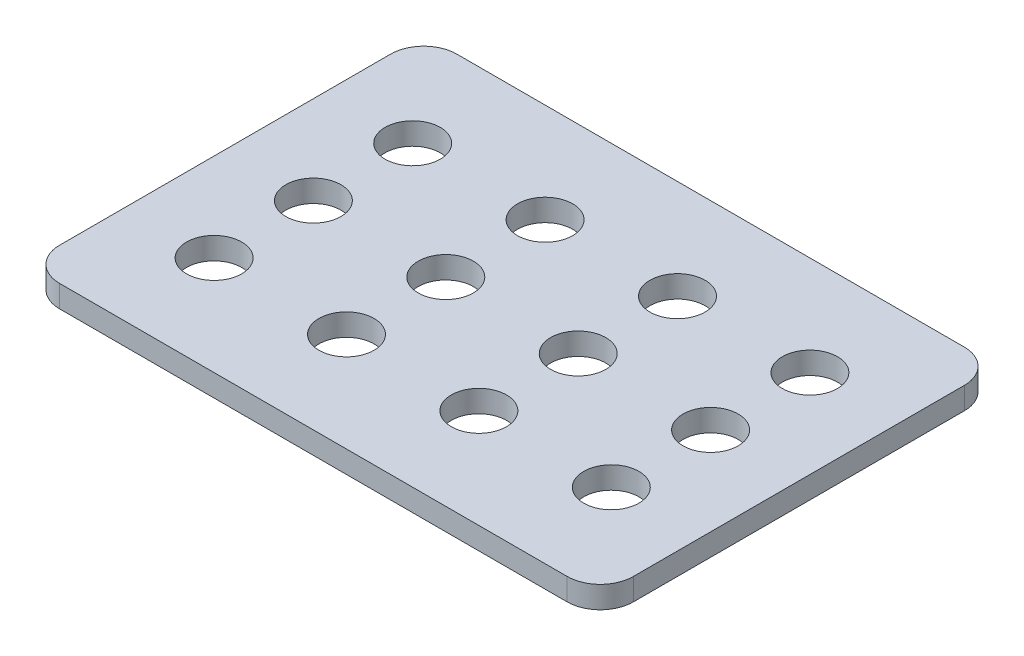
ISO-10303-21;
HEADER;
FILE_DESCRIPTION(('STEP AP214'),'2;1');
FILE_NAME('part.step','',(''),(''),'','','');
FILE_SCHEMA(('AUTOMOTIVE_DESIGN { 1 0 10303 214 1 1 1 1 }'));
ENDSEC;
DATA;
#1=APPLICATION_CONTEXT('core data for automotive mechanical design processes');
#2=APPLICATION_PROTOCOL_DEFINITION('international standard','automotive_design',2000,#1);
#3=PRODUCT_CONTEXT('',#1,'mechanical');
#4=PRODUCT('Part','Part','',(#3));
#5=PRODUCT_RELATED_PRODUCT_CATEGORY('part','',(#4));
#6=PRODUCT_DEFINITION_FORMATION('','',#4);
#7=PRODUCT_DEFINITION_CONTEXT('part definition',#1,'design');
#8=PRODUCT_DEFINITION('design','',#6,#7);
#9=PRODUCT_DEFINITION_SHAPE('','',#8);
#10=(LENGTH_UNIT() NAMED_UNIT(*) SI_UNIT(.MILLI.,.METRE.));
#11=(NAMED_UNIT(*) PLANE_ANGLE_UNIT() SI_UNIT($,.RADIAN.));
#12=(NAMED_UNIT(*) SI_UNIT($,.STERADIAN.) SOLID_ANGLE_UNIT());
#13=UNCERTAINTY_MEASURE_WITH_UNIT(LENGTH_MEASURE(1.E-05),#10,'distance_accuracy_value','');
#14=(GEOMETRIC_REPRESENTATION_CONTEXT(3) GLOBAL_UNCERTAINTY_ASSIGNED_CONTEXT((#13)) GLOBAL_UNIT_ASSIGNED_CONTEXT((#10,
#11,#12)) REPRESENTATION_CONTEXT('',''));
#15=CARTESIAN_POINT('',(0.,0.,0.));
#16=DIRECTION('',(0.,0.,1.));
#17=DIRECTION('',(1.,0.,0.));
#18=AXIS2_PLACEMENT_3D('',#15,#16,#17);
#19=CARTESIAN_POINT('',(15.,10.,-15.));
#20=DIRECTION('',(0.,-1.,0.));
#21=DIRECTION('',(0.,0.,-1.));
#22=AXIS2_PLACEMENT_3D('',#19,#20,#21);
#23=CYLINDRICAL_SURFACE('',#22,15.);
#24=CARTESIAN_POINT('',(15.,0.,-15.));
#25=DIRECTION('',(0.,1.,0.));
#26=DIRECTION('',(0.,0.,1.));
#27=AXIS2_PLACEMENT_3D('',#24,#25,#26);
#28=CIRCLE('',#27,15.);
#29=CARTESIAN_POINT('',(15.0000000000001,0.,0.));
#30=VERTEX_POINT('',#29);
#31=CARTESIAN_POINT('',(0.,0.,-15.0000000000001));
#32=VERTEX_POINT('',#31);
#33=EDGE_CURVE('E196',#30,#32,#28,.F.);
#34=ORIENTED_EDGE('',*,*,#33,.F.);
#35=DIRECTION('',(0.,-1.,0.));
#36=VECTOR('',#35,1.);
#37=CARTESIAN_POINT('',(15.0000000000001,10.,0.));
#38=LINE('',#37,#36);
#39=CARTESIAN_POINT('',(15.0000000000001,10.,0.));
#40=VERTEX_POINT('',#39);
#41=EDGE_CURVE('E11',#40,#30,#38,.T.);
#42=ORIENTED_EDGE('',*,*,#41,.F.);
#43=CARTESIAN_POINT('',(15.,10.,-15.));
#44=DIRECTION('',(0.,1.,0.));
#45=DIRECTION('',(0.,0.,1.));
#46=AXIS2_PLACEMENT_3D('',#43,#44,#45);
#47=CIRCLE('',#46,15.);
#48=CARTESIAN_POINT('',(0.,10.,-15.0000000000001));
#49=VERTEX_POINT('',#48);
#50=EDGE_CURVE('E511',#40,#49,#47,.F.);
#51=ORIENTED_EDGE('',*,*,#50,.T.);
#52=DIRECTION('',(0.,-1.,0.));
#53=VECTOR('',#52,1.);
#54=CARTESIAN_POINT('',(0.,10.,-15.0000000000001));
#55=LINE('',#54,#53);
#56=EDGE_CURVE('E62',#49,#32,#55,.T.);
#57=ORIENTED_EDGE('',*,*,#56,.T.);
#58=EDGE_LOOP('',(#34,#42,#51,#57));
#59=FACE_BOUND('',#58,.T.);
#60=ADVANCED_FACE('F50',(#59),#23,.T.);
#61=CARTESIAN_POINT('',(0.,10.,0.));
#62=DIRECTION('',(0.,0.,-1.));
#63=DIRECTION('',(-1.,0.,0.));
#64=AXIS2_PLACEMENT_3D('',#61,#62,#63);
#65=PLANE('',#64);
#66=DIRECTION('',(1.,0.,0.));
#67=VECTOR('',#66,1.);
#68=CARTESIAN_POINT('',(0.,0.,0.));
#69=LINE('',#68,#67);
#70=CARTESIAN_POINT('',(245.,0.,0.));
#71=VERTEX_POINT('',#70);
#72=EDGE_CURVE('E203',#30,#71,#69,.T.);
#73=ORIENTED_EDGE('',*,*,#72,.T.);
#74=DIRECTION('',(0.,-1.,0.));
#75=VECTOR('',#74,1.);
#76=CARTESIAN_POINT('',(245.,10.,0.));
#77=LINE('',#76,#75);
#78=CARTESIAN_POINT('',(245.,10.,0.));
#79=VERTEX_POINT('',#78);
#80=EDGE_CURVE('E60',#79,#71,#77,.T.);
#81=ORIENTED_EDGE('',*,*,#80,.F.);
#82=DIRECTION('',(1.,0.,0.));
#83=VECTOR('',#82,1.);
#84=CARTESIAN_POINT('',(0.,10.,0.));
#85=LINE('',#84,#83);
#86=EDGE_CURVE('E508',#40,#79,#85,.T.);
#87=ORIENTED_EDGE('',*,*,#86,.F.);
#88=ORIENTED_EDGE('',*,*,#41,.T.);
#89=EDGE_LOOP('',(#73,#81,#87,#88));
#90=FACE_BOUND('',#89,.T.);
#91=ADVANCED_FACE('F273',(#90),#65,.F.);
#92=CARTESIAN_POINT('',(245.,10.,-15.));
#93=DIRECTION('',(0.,-1.,0.));
#94=DIRECTION('',(0.,0.,-1.));
#95=AXIS2_PLACEMENT_3D('',#92,#93,#94);
#96=CYLINDRICAL_SURFACE('',#95,15.);
#97=CARTESIAN_POINT('',(245.,0.,-15.));
#98=DIRECTION('',(0.,1.,0.));
#99=DIRECTION('',(0.,0.,1.));
#100=AXIS2_PLACEMENT_3D('',#97,#98,#99);
#101=CIRCLE('',#100,15.);
#102=CARTESIAN_POINT('',(260.,0.,-15.0000000000001));
#103=VERTEX_POINT('',#102);
#104=EDGE_CURVE('E202',#71,#103,#101,.T.);
#105=ORIENTED_EDGE('',*,*,#104,.T.);
#106=DIRECTION('',(0.,-1.,0.));
#107=VECTOR('',#106,1.);
#108=CARTESIAN_POINT('',(260.,10.,-15.0000000000001));
#109=LINE('',#108,#107);
#110=CARTESIAN_POINT('',(260.,10.,-15.0000000000001));
#111=VERTEX_POINT('',#110);
#112=EDGE_CURVE('E257',#111,#103,#109,.T.);
#113=ORIENTED_EDGE('',*,*,#112,.F.);
#114=CARTESIAN_POINT('',(245.,10.,-15.));
#115=DIRECTION('',(0.,1.,0.));
#116=DIRECTION('',(0.,0.,1.));
#117=AXIS2_PLACEMENT_3D('',#114,#115,#116);
#118=CIRCLE('',#117,15.);
#119=EDGE_CURVE('E269',#79,#111,#118,.T.);
#120=ORIENTED_EDGE('',*,*,#119,.F.);
#121=ORIENTED_EDGE('',*,*,#80,.T.);
#122=EDGE_LOOP('',(#105,#113,#120,#121));
#123=FACE_BOUND('',#122,.T.);
#124=ADVANCED_FACE('F270',(#123),#96,.T.);
#125=CARTESIAN_POINT('',(260.,10.,0.));
#126=DIRECTION('',(-1.,0.,0.));
#127=DIRECTION('',(0.,0.,1.));
#128=AXIS2_PLACEMENT_3D('',#125,#126,#127);
#129=PLANE('',#128);
#130=DIRECTION('',(0.,0.,-1.));
#131=VECTOR('',#130,1.);
#132=CARTESIAN_POINT('',(260.,0.,0.));
#133=LINE('',#132,#131);
#134=CARTESIAN_POINT('',(260.,0.,-165.));
#135=VERTEX_POINT('',#134);
#136=EDGE_CURVE('E207',#103,#135,#133,.T.);
#137=ORIENTED_EDGE('',*,*,#136,.T.);
#138=DIRECTION('',(0.,-1.,0.));
#139=VECTOR('',#138,1.);
#140=CARTESIAN_POINT('',(260.,10.,-165.));
#141=LINE('',#140,#139);
#142=CARTESIAN_POINT('',(260.,10.,-165.));
#143=VERTEX_POINT('',#142);
#144=EDGE_CURVE('E260',#143,#135,#141,.T.);
#145=ORIENTED_EDGE('',*,*,#144,.F.);
#146=DIRECTION('',(0.,0.,-1.));
#147=VECTOR('',#146,1.);
#148=CARTESIAN_POINT('',(260.,10.,0.));
#149=LINE('',#148,#147);
#150=EDGE_CURVE('E145',#111,#143,#149,.T.);
#151=ORIENTED_EDGE('',*,*,#150,.F.);
#152=ORIENTED_EDGE('',*,*,#112,.T.);
#153=EDGE_LOOP('',(#137,#145,#151,#152));
#154=FACE_BOUND('',#153,.T.);
#155=ADVANCED_FACE('F369',(#154),#129,.F.);
#156=CARTESIAN_POINT('',(245.,10.,-165.));
#157=DIRECTION('',(0.,-1.,0.));
#158=DIRECTION('',(0.,0.,-1.));
#159=AXIS2_PLACEMENT_3D('',#156,#157,#158);
#160=CYLINDRICAL_SURFACE('',#159,15.);
#161=CARTESIAN_POINT('',(245.,0.,-165.));
#162=DIRECTION('',(0.,1.,0.));
#163=DIRECTION('',(0.,0.,1.));
#164=AXIS2_PLACEMENT_3D('',#161,#162,#163);
#165=CIRCLE('',#164,15.);
#166=CARTESIAN_POINT('',(245.,0.,-180.));
#167=VERTEX_POINT('',#166);
#168=EDGE_CURVE('E213',#167,#135,#165,.F.);
#169=ORIENTED_EDGE('',*,*,#168,.F.);
#170=DIRECTION('',(0.,-1.,0.));
#171=VECTOR('',#170,1.);
#172=CARTESIAN_POINT('',(245.,10.,-180.));
#173=LINE('',#172,#171);
#174=CARTESIAN_POINT('',(245.,10.,-180.));
#175=VERTEX_POINT('',#174);
#176=EDGE_CURVE('E127',#175,#167,#173,.T.);
#177=ORIENTED_EDGE('',*,*,#176,.F.);
#178=CARTESIAN_POINT('',(245.,10.,-165.));
#179=DIRECTION('',(0.,1.,0.));
#180=DIRECTION('',(0.,0.,1.));
#181=AXIS2_PLACEMENT_3D('',#178,#179,#180);
#182=CIRCLE('',#181,15.);
#183=EDGE_CURVE('E137',#175,#143,#182,.F.);
#184=ORIENTED_EDGE('',*,*,#183,.T.);
#185=ORIENTED_EDGE('',*,*,#144,.T.);
#186=EDGE_LOOP('',(#169,#177,#184,#185));
#187=FACE_BOUND('',#186,.T.);
#188=ADVANCED_FACE('F368',(#187),#160,.T.);
#189=CARTESIAN_POINT('',(0.,10.,-180.));
#190=DIRECTION('',(0.,0.,-1.));
#191=DIRECTION('',(-1.,0.,0.));
#192=AXIS2_PLACEMENT_3D('',#189,#190,#191);
#193=PLANE('',#192);
#194=DIRECTION('',(1.,0.,0.));
#195=VECTOR('',#194,1.);
#196=CARTESIAN_POINT('',(0.,0.,-180.));
#197=LINE('',#196,#195);
#198=CARTESIAN_POINT('',(15.0000000000001,0.,-180.));
#199=VERTEX_POINT('',#198);
#200=EDGE_CURVE('E121',#199,#167,#197,.T.);
#201=ORIENTED_EDGE('',*,*,#200,.F.);
#202=DIRECTION('',(0.,-1.,0.));
#203=VECTOR('',#202,1.);
#204=CARTESIAN_POINT('',(15.0000000000001,10.,-180.));
#205=LINE('',#204,#203);
#206=CARTESIAN_POINT('',(15.0000000000001,10.,-180.));
#207=VERTEX_POINT('',#206);
#208=EDGE_CURVE('E119',#207,#199,#205,.T.);
#209=ORIENTED_EDGE('',*,*,#208,.F.);
#210=DIRECTION('',(1.,0.,0.));
#211=VECTOR('',#210,1.);
#212=CARTESIAN_POINT('',(0.,10.,-180.));
#213=LINE('',#212,#211);
#214=EDGE_CURVE('E117',#207,#175,#213,.T.);
#215=ORIENTED_EDGE('',*,*,#214,.T.);
#216=ORIENTED_EDGE('',*,*,#176,.T.);
#217=EDGE_LOOP('',(#201,#209,#215,#216));
#218=FACE_BOUND('',#217,.T.);
#219=ADVANCED_FACE('F120',(#218),#193,.T.);
#220=CARTESIAN_POINT('',(15.,10.,-165.));
#221=DIRECTION('',(0.,-1.,0.));
#222=DIRECTION('',(0.,0.,-1.));
#223=AXIS2_PLACEMENT_3D('',#220,#221,#222);
#224=CYLINDRICAL_SURFACE('',#223,15.);
#225=CARTESIAN_POINT('',(15.,0.,-165.));
#226=DIRECTION('',(0.,1.,0.));
#227=DIRECTION('',(0.,0.,1.));
#228=AXIS2_PLACEMENT_3D('',#225,#226,#227);
#229=CIRCLE('',#228,15.);
#230=CARTESIAN_POINT('',(0.,0.,-165.));
#231=VERTEX_POINT('',#230);
#232=EDGE_CURVE('E218',#199,#231,#229,.T.);
#233=ORIENTED_EDGE('',*,*,#232,.T.);
#234=DIRECTION('',(0.,-1.,0.));
#235=VECTOR('',#234,1.);
#236=CARTESIAN_POINT('',(0.,10.,-165.));
#237=LINE('',#236,#235);
#238=CARTESIAN_POINT('',(0.,10.,-165.));
#239=VERTEX_POINT('',#238);
#240=EDGE_CURVE('E93',#239,#231,#237,.T.);
#241=ORIENTED_EDGE('',*,*,#240,.F.);
#242=CARTESIAN_POINT('',(15.,10.,-165.));
#243=DIRECTION('',(0.,1.,0.));
#244=DIRECTION('',(0.,0.,1.));
#245=AXIS2_PLACEMENT_3D('',#242,#243,#244);
#246=CIRCLE('',#245,15.);
#247=EDGE_CURVE('E126',#207,#239,#246,.T.);
#248=ORIENTED_EDGE('',*,*,#247,.F.);
#249=ORIENTED_EDGE('',*,*,#208,.T.);
#250=EDGE_LOOP('',(#233,#241,#248,#249));
#251=FACE_BOUND('',#250,.T.);
#252=ADVANCED_FACE('F129',(#251),#224,.T.);
#253=CARTESIAN_POINT('',(160.,10.,-90.));
#254=DIRECTION('',(0.,-1.,0.));
#255=DIRECTION('',(0.,0.,-1.));
#256=AXIS2_PLACEMENT_3D('',#253,#254,#255);
#257=CYLINDRICAL_SURFACE('',#256,12.5);
#258=CARTESIAN_POINT('',(160.,10.,-90.));
#259=DIRECTION('',(0.,1.,0.));
#260=DIRECTION('',(0.,0.,1.));
#261=AXIS2_PLACEMENT_3D('',#258,#259,#260);
#262=CIRCLE('',#261,12.5);
#263=CARTESIAN_POINT('',(160.,10.,-77.5));
#264=VERTEX_POINT('',#263);
#265=EDGE_CURVE('E167',#264,#264,#262,.F.);
#266=ORIENTED_EDGE('',*,*,#265,.F.);
#267=EDGE_LOOP('',(#266));
#268=FACE_BOUND('',#267,.T.);
#269=CARTESIAN_POINT('',(160.,0.,-90.));
#270=DIRECTION('',(0.,1.,0.));
#271=DIRECTION('',(0.,0.,1.));
#272=AXIS2_PLACEMENT_3D('',#269,#270,#271);
#273=CIRCLE('',#272,12.5);
#274=CARTESIAN_POINT('',(160.,0.,-77.5));
#275=VERTEX_POINT('',#274);
#276=EDGE_CURVE('E241',#275,#275,#273,.F.);
#277=ORIENTED_EDGE('',*,*,#276,.T.);
#278=EDGE_LOOP('',(#277));
#279=FACE_BOUND('',#278,.T.);
#280=ADVANCED_FACE('F337',(#268,#279),#257,.F.);
#281=CARTESIAN_POINT('',(220.,10.,-45.));
#282=DIRECTION('',(0.,-1.,0.));
#283=DIRECTION('',(0.,0.,-1.));
#284=AXIS2_PLACEMENT_3D('',#281,#282,#283);
#285=CYLINDRICAL_SURFACE('',#284,12.5);
#286=CARTESIAN_POINT('',(220.,10.,-45.));
#287=DIRECTION('',(0.,1.,0.));
#288=DIRECTION('',(0.,0.,1.));
#289=AXIS2_PLACEMENT_3D('',#286,#287,#288);
#290=CIRCLE('',#289,12.5);
#291=CARTESIAN_POINT('',(220.,10.,-32.5));
#292=VERTEX_POINT('',#291);
#293=EDGE_CURVE('E165',#292,#292,#290,.F.);
#294=ORIENTED_EDGE('',*,*,#293,.F.);
#295=EDGE_LOOP('',(#294));
#296=FACE_BOUND('',#295,.T.);
#297=CARTESIAN_POINT('',(220.,0.,-45.));
#298=DIRECTION('',(0.,1.,0.));
#299=DIRECTION('',(0.,0.,1.));
#300=AXIS2_PLACEMENT_3D('',#297,#298,#299);
#301=CIRCLE('',#300,12.5);
#302=CARTESIAN_POINT('',(220.,0.,-32.5));
#303=VERTEX_POINT('',#302);
#304=EDGE_CURVE('E236',#303,#303,#301,.F.);
#305=ORIENTED_EDGE('',*,*,#304,.T.);
#306=EDGE_LOOP('',(#305));
#307=FACE_BOUND('',#306,.T.);
#308=ADVANCED_FACE('F345',(#296,#307),#285,.F.);
#309=CARTESIAN_POINT('',(160.,10.,-45.));
#310=DIRECTION('',(0.,-1.,0.));
#311=DIRECTION('',(0.,0.,-1.));
#312=AXIS2_PLACEMENT_3D('',#309,#310,#311);
#313=CYLINDRICAL_SURFACE('',#312,12.5);
#314=CARTESIAN_POINT('',(160.,10.,-45.));
#315=DIRECTION('',(0.,1.,0.));
#316=DIRECTION('',(0.,0.,1.));
#317=AXIS2_PLACEMENT_3D('',#314,#315,#316);
#318=CIRCLE('',#317,12.5);
#319=CARTESIAN_POINT('',(160.,10.,-32.5));
#320=VERTEX_POINT('',#319);
#321=EDGE_CURVE('E158',#320,#320,#318,.F.);
#322=ORIENTED_EDGE('',*,*,#321,.F.);
#323=EDGE_LOOP('',(#322));
#324=FACE_BOUND('',#323,.T.);
#325=CARTESIAN_POINT('',(160.,0.,-45.));
#326=DIRECTION('',(0.,1.,0.));
#327=DIRECTION('',(0.,0.,1.));
#328=AXIS2_PLACEMENT_3D('',#325,#326,#327);
#329=CIRCLE('',#328,12.5);
#330=CARTESIAN_POINT('',(160.,0.,-32.5));
#331=VERTEX_POINT('',#330);
#332=EDGE_CURVE('E233',#331,#331,#329,.F.);
#333=ORIENTED_EDGE('',*,*,#332,.T.);
#334=EDGE_LOOP('',(#333));
#335=FACE_BOUND('',#334,.T.);
#336=ADVANCED_FACE('F350',(#324,#335),#313,.F.);
#337=CARTESIAN_POINT('',(220.,10.,-90.));
#338=DIRECTION('',(0.,-1.,0.));
#339=DIRECTION('',(0.,0.,-1.));
#340=AXIS2_PLACEMENT_3D('',#337,#338,#339);
#341=CYLINDRICAL_SURFACE('',#340,12.5);
#342=CARTESIAN_POINT('',(220.,10.,-90.));
#343=DIRECTION('',(0.,1.,0.));
#344=DIRECTION('',(0.,0.,1.));
#345=AXIS2_PLACEMENT_3D('',#342,#343,#344);
#346=CIRCLE('',#345,12.5);
#347=CARTESIAN_POINT('',(220.,10.,-77.5));
#348=VERTEX_POINT('',#347);
#349=EDGE_CURVE('E152',#348,#348,#346,.F.);
#350=ORIENTED_EDGE('',*,*,#349,.F.);
#351=EDGE_LOOP('',(#350));
#352=FACE_BOUND('',#351,.T.);
#353=CARTESIAN_POINT('',(220.,0.,-90.));
#354=DIRECTION('',(0.,1.,0.));
#355=DIRECTION('',(0.,0.,1.));
#356=AXIS2_PLACEMENT_3D('',#353,#354,#355);
#357=CIRCLE('',#356,12.5);
#358=CARTESIAN_POINT('',(220.,0.,-77.5));
#359=VERTEX_POINT('',#358);
#360=EDGE_CURVE('E227',#359,#359,#357,.F.);
#361=ORIENTED_EDGE('',*,*,#360,.T.);
#362=EDGE_LOOP('',(#361));
#363=FACE_BOUND('',#362,.T.);
#364=ADVANCED_FACE('F354',(#352,#363),#341,.F.);
#365=CARTESIAN_POINT('',(160.,10.,-135.));
#366=DIRECTION('',(0.,-1.,0.));
#367=DIRECTION('',(0.,0.,-1.));
#368=AXIS2_PLACEMENT_3D('',#365,#366,#367);
#369=CYLINDRICAL_SURFACE('',#368,12.5);
#370=CARTESIAN_POINT('',(160.,10.,-135.));
#371=DIRECTION('',(0.,1.,0.));
#372=DIRECTION('',(0.,0.,1.));
#373=AXIS2_PLACEMENT_3D('',#370,#371,#372);
#374=CIRCLE('',#373,12.5);
#375=CARTESIAN_POINT('',(160.,10.,-122.5));
#376=VERTEX_POINT('',#375);
#377=EDGE_CURVE('E147',#376,#376,#374,.F.);
#378=ORIENTED_EDGE('',*,*,#377,.F.);
#379=EDGE_LOOP('',(#378));
#380=FACE_BOUND('',#379,.T.);
#381=CARTESIAN_POINT('',(160.,0.,-135.));
#382=DIRECTION('',(0.,1.,0.));
#383=DIRECTION('',(0.,0.,1.));
#384=AXIS2_PLACEMENT_3D('',#381,#382,#383);
#385=CIRCLE('',#384,12.5);
#386=CARTESIAN_POINT('',(160.,0.,-122.5));
#387=VERTEX_POINT('',#386);
#388=EDGE_CURVE('E229',#387,#387,#385,.F.);
#389=ORIENTED_EDGE('',*,*,#388,.T.);
#390=EDGE_LOOP('',(#389));
#391=FACE_BOUND('',#390,.T.);
#392=ADVANCED_FACE('F352',(#380,#391),#369,.F.);
#393=CARTESIAN_POINT('',(0.,10.,0.));
#394=DIRECTION('',(-1.,0.,0.));
#395=DIRECTION('',(0.,0.,1.));
#396=AXIS2_PLACEMENT_3D('',#393,#394,#395);
#397=PLANE('',#396);
#398=DIRECTION('',(0.,0.,-1.));
#399=VECTOR('',#398,1.);
#400=CARTESIAN_POINT('',(0.,0.,0.));
#401=LINE('',#400,#399);
#402=EDGE_CURVE('E225',#32,#231,#401,.T.);
#403=ORIENTED_EDGE('',*,*,#402,.F.);
#404=ORIENTED_EDGE('',*,*,#56,.F.);
#405=DIRECTION('',(0.,0.,-1.));
#406=VECTOR('',#405,1.);
#407=CARTESIAN_POINT('',(0.,10.,0.));
#408=LINE('',#407,#406);
#409=EDGE_CURVE('E135',#49,#239,#408,.T.);
#410=ORIENTED_EDGE('',*,*,#409,.T.);
#411=ORIENTED_EDGE('',*,*,#240,.T.);
#412=EDGE_LOOP('',(#403,#404,#410,#411));
#413=FACE_BOUND('',#412,.T.);
#414=ADVANCED_FACE('F287',(#413),#397,.T.);
#415=CARTESIAN_POINT('',(40.,10.,-135.));
#416=DIRECTION('',(0.,-1.,0.));
#417=DIRECTION('',(0.,0.,-1.));
#418=AXIS2_PLACEMENT_3D('',#415,#416,#417);
#419=CYLINDRICAL_SURFACE('',#418,12.5);
#420=CARTESIAN_POINT('',(40.,10.,-135.));
#421=DIRECTION('',(0.,1.,0.));
#422=DIRECTION('',(0.,0.,1.));
#423=AXIS2_PLACEMENT_3D('',#420,#421,#422);
#424=CIRCLE('',#423,12.5);
#425=CARTESIAN_POINT('',(40.,10.,-122.5));
#426=VERTEX_POINT('',#425);
#427=EDGE_CURVE('E520',#426,#426,#424,.T.);
#428=ORIENTED_EDGE('',*,*,#427,.T.);
#429=EDGE_LOOP('',(#428));
#430=FACE_BOUND('',#429,.T.);
#431=CARTESIAN_POINT('',(40.,0.,-135.));
#432=DIRECTION('',(0.,1.,0.));
#433=DIRECTION('',(0.,0.,1.));
#434=AXIS2_PLACEMENT_3D('',#431,#432,#433);
#435=CIRCLE('',#434,12.5);
#436=CARTESIAN_POINT('',(40.,0.,-122.5));
#437=VERTEX_POINT('',#436);
#438=EDGE_CURVE('E193',#437,#437,#435,.T.);
#439=ORIENTED_EDGE('',*,*,#438,.F.);
#440=EDGE_LOOP('',(#439));
#441=FACE_BOUND('',#440,.T.);
#442=ADVANCED_FACE('F289',(#430,#441),#419,.F.);
#443=CARTESIAN_POINT('',(100.,10.,-135.));
#444=DIRECTION('',(0.,-1.,0.));
#445=DIRECTION('',(0.,0.,-1.));
#446=AXIS2_PLACEMENT_3D('',#443,#444,#445);
#447=CYLINDRICAL_SURFACE('',#446,12.5);
#448=CARTESIAN_POINT('',(100.,10.,-135.));
#449=DIRECTION('',(0.,1.,0.));
#450=DIRECTION('',(0.,0.,1.));
#451=AXIS2_PLACEMENT_3D('',#448,#449,#450);
#452=CIRCLE('',#451,12.5);
#453=CARTESIAN_POINT('',(100.,10.,-122.5));
#454=VERTEX_POINT('',#453);
#455=EDGE_CURVE('E521',#454,#454,#452,.T.);
#456=ORIENTED_EDGE('',*,*,#455,.T.);
#457=EDGE_LOOP('',(#456));
#458=FACE_BOUND('',#457,.T.);
#459=CARTESIAN_POINT('',(100.,0.,-135.));
#460=DIRECTION('',(0.,1.,0.));
#461=DIRECTION('',(0.,0.,1.));
#462=AXIS2_PLACEMENT_3D('',#459,#460,#461);
#463=CIRCLE('',#462,12.5);
#464=CARTESIAN_POINT('',(100.,0.,-122.5));
#465=VERTEX_POINT('',#464);
#466=EDGE_CURVE('E187',#465,#465,#463,.T.);
#467=ORIENTED_EDGE('',*,*,#466,.F.);
#468=EDGE_LOOP('',(#467));
#469=FACE_BOUND('',#468,.T.);
#470=ADVANCED_FACE('F288',(#458,#469),#447,.F.);
#471=CARTESIAN_POINT('',(100.,10.,-90.));
#472=DIRECTION('',(0.,-1.,0.));
#473=DIRECTION('',(0.,0.,-1.));
#474=AXIS2_PLACEMENT_3D('',#471,#472,#473);
#475=CYLINDRICAL_SURFACE('',#474,12.5);
#476=CARTESIAN_POINT('',(100.,10.,-90.));
#477=DIRECTION('',(0.,1.,0.));
#478=DIRECTION('',(0.,0.,1.));
#479=AXIS2_PLACEMENT_3D('',#476,#477,#478);
#480=CIRCLE('',#479,12.5);
#481=CARTESIAN_POINT('',(100.,10.,-77.5));
#482=VERTEX_POINT('',#481);
#483=EDGE_CURVE('E528',#482,#482,#480,.T.);
#484=ORIENTED_EDGE('',*,*,#483,.T.);
#485=EDGE_LOOP('',(#484));
#486=FACE_BOUND('',#485,.T.);
#487=CARTESIAN_POINT('',(100.,0.,-90.));
#488=DIRECTION('',(0.,1.,0.));
#489=DIRECTION('',(0.,0.,1.));
#490=AXIS2_PLACEMENT_3D('',#487,#488,#489);
#491=CIRCLE('',#490,12.5);
#492=CARTESIAN_POINT('',(100.,0.,-77.5));
#493=VERTEX_POINT('',#492);
#494=EDGE_CURVE('E189',#493,#493,#491,.T.);
#495=ORIENTED_EDGE('',*,*,#494,.F.);
#496=EDGE_LOOP('',(#495));
#497=FACE_BOUND('',#496,.T.);
#498=ADVANCED_FACE('F294',(#486,#497),#475,.F.);
#499=CARTESIAN_POINT('',(40.,10.,-90.));
#500=DIRECTION('',(0.,-1.,0.));
#501=DIRECTION('',(0.,0.,-1.));
#502=AXIS2_PLACEMENT_3D('',#499,#500,#501);
#503=CYLINDRICAL_SURFACE('',#502,12.5);
#504=CARTESIAN_POINT('',(40.,10.,-90.));
#505=DIRECTION('',(0.,1.,0.));
#506=DIRECTION('',(0.,0.,1.));
#507=AXIS2_PLACEMENT_3D('',#504,#505,#506);
#508=CIRCLE('',#507,12.5);
#509=CARTESIAN_POINT('',(40.,10.,-77.5));
#510=VERTEX_POINT('',#509);
#511=EDGE_CURVE('E529',#510,#510,#508,.T.);
#512=ORIENTED_EDGE('',*,*,#511,.T.);
#513=EDGE_LOOP('',(#512));
#514=FACE_BOUND('',#513,.T.);
#515=CARTESIAN_POINT('',(40.,0.,-90.));
#516=DIRECTION('',(0.,1.,0.));
#517=DIRECTION('',(0.,0.,1.));
#518=AXIS2_PLACEMENT_3D('',#515,#516,#517);
#519=CIRCLE('',#518,12.5);
#520=CARTESIAN_POINT('',(40.,0.,-77.5));
#521=VERTEX_POINT('',#520);
#522=EDGE_CURVE('E185',#521,#521,#519,.T.);
#523=ORIENTED_EDGE('',*,*,#522,.F.);
#524=EDGE_LOOP('',(#523));
#525=FACE_BOUND('',#524,.T.);
#526=ADVANCED_FACE('F300',(#514,#525),#503,.F.);
#527=CARTESIAN_POINT('',(40.,10.,-45.));
#528=DIRECTION('',(0.,-1.,0.));
#529=DIRECTION('',(0.,0.,-1.));
#530=AXIS2_PLACEMENT_3D('',#527,#528,#529);
#531=CYLINDRICAL_SURFACE('',#530,12.5);
#532=CARTESIAN_POINT('',(40.,10.,-45.));
#533=DIRECTION('',(0.,1.,0.));
#534=DIRECTION('',(0.,0.,1.));
#535=AXIS2_PLACEMENT_3D('',#532,#533,#534);
#536=CIRCLE('',#535,12.5);
#537=CARTESIAN_POINT('',(40.,10.,-32.5));
#538=VERTEX_POINT('',#537);
#539=EDGE_CURVE('E311',#538,#538,#536,.T.);
#540=ORIENTED_EDGE('',*,*,#539,.T.);
#541=EDGE_LOOP('',(#540));
#542=FACE_BOUND('',#541,.T.);
#543=CARTESIAN_POINT('',(40.,0.,-45.));
#544=DIRECTION('',(0.,1.,0.));
#545=DIRECTION('',(0.,0.,1.));
#546=AXIS2_PLACEMENT_3D('',#543,#544,#545);
#547=CIRCLE('',#546,12.5);
#548=CARTESIAN_POINT('',(40.,0.,-32.5));
#549=VERTEX_POINT('',#548);
#550=EDGE_CURVE('E180',#549,#549,#547,.T.);
#551=ORIENTED_EDGE('',*,*,#550,.F.);
#552=EDGE_LOOP('',(#551));
#553=FACE_BOUND('',#552,.T.);
#554=ADVANCED_FACE('F304',(#542,#553),#531,.F.);
#555=CARTESIAN_POINT('',(100.,10.,-45.));
#556=DIRECTION('',(0.,-1.,0.));
#557=DIRECTION('',(0.,0.,-1.));
#558=AXIS2_PLACEMENT_3D('',#555,#556,#557);
#559=CYLINDRICAL_SURFACE('',#558,12.5);
#560=CARTESIAN_POINT('',(100.,10.,-45.));
#561=DIRECTION('',(0.,1.,0.));
#562=DIRECTION('',(0.,0.,1.));
#563=AXIS2_PLACEMENT_3D('',#560,#561,#562);
#564=CIRCLE('',#563,12.5);
#565=CARTESIAN_POINT('',(100.,10.,-32.5));
#566=VERTEX_POINT('',#565);
#567=EDGE_CURVE('E247',#566,#566,#564,.T.);
#568=ORIENTED_EDGE('',*,*,#567,.T.);
#569=EDGE_LOOP('',(#568));
#570=FACE_BOUND('',#569,.T.);
#571=CARTESIAN_POINT('',(100.,0.,-45.));
#572=DIRECTION('',(0.,1.,0.));
#573=DIRECTION('',(0.,0.,1.));
#574=AXIS2_PLACEMENT_3D('',#571,#572,#573);
#575=CIRCLE('',#574,12.5);
#576=CARTESIAN_POINT('',(100.,0.,-32.5));
#577=VERTEX_POINT('',#576);
#578=EDGE_CURVE('E173',#577,#577,#575,.T.);
#579=ORIENTED_EDGE('',*,*,#578,.F.);
#580=EDGE_LOOP('',(#579));
#581=FACE_BOUND('',#580,.T.);
#582=ADVANCED_FACE('F47',(#570,#581),#559,.F.);
#583=CARTESIAN_POINT('',(220.,10.,-135.));
#584=DIRECTION('',(0.,-1.,0.));
#585=DIRECTION('',(0.,0.,-1.));
#586=AXIS2_PLACEMENT_3D('',#583,#584,#585);
#587=CYLINDRICAL_SURFACE('',#586,12.5);
#588=CARTESIAN_POINT('',(220.,10.,-135.));
#589=DIRECTION('',(0.,1.,0.));
#590=DIRECTION('',(0.,0.,1.));
#591=AXIS2_PLACEMENT_3D('',#588,#589,#590);
#592=CIRCLE('',#591,12.5);
#593=CARTESIAN_POINT('',(220.,10.,-122.5));
#594=VERTEX_POINT('',#593);
#595=EDGE_CURVE('E168',#594,#594,#592,.F.);
#596=ORIENTED_EDGE('',*,*,#595,.F.);
#597=EDGE_LOOP('',(#596));
#598=FACE_BOUND('',#597,.T.);
#599=CARTESIAN_POINT('',(220.,0.,-135.));
#600=DIRECTION('',(0.,1.,0.));
#601=DIRECTION('',(0.,0.,1.));
#602=AXIS2_PLACEMENT_3D('',#599,#600,#601);
#603=CIRCLE('',#602,12.5);
#604=CARTESIAN_POINT('',(220.,0.,-122.5));
#605=VERTEX_POINT('',#604);
#606=EDGE_CURVE('E249',#605,#605,#603,.F.);
#607=ORIENTED_EDGE('',*,*,#606,.T.);
#608=EDGE_LOOP('',(#607));
#609=FACE_BOUND('',#608,.T.);
#610=ADVANCED_FACE('F306',(#598,#609),#587,.F.);
#611=CARTESIAN_POINT('',(0.,10.,0.));
#612=DIRECTION('',(0.,1.,0.));
#613=DIRECTION('',(0.,0.,1.));
#614=AXIS2_PLACEMENT_3D('',#611,#612,#613);
#615=PLANE('',#614);
#616=ORIENTED_EDGE('',*,*,#567,.F.);
#617=EDGE_LOOP('',(#616));
#618=FACE_BOUND('',#617,.T.);
#619=ORIENTED_EDGE('',*,*,#539,.F.);
#620=EDGE_LOOP('',(#619));
#621=FACE_BOUND('',#620,.T.);
#622=ORIENTED_EDGE('',*,*,#511,.F.);
#623=EDGE_LOOP('',(#622));
#624=FACE_BOUND('',#623,.T.);
#625=ORIENTED_EDGE('',*,*,#483,.F.);
#626=EDGE_LOOP('',(#625));
#627=FACE_BOUND('',#626,.T.);
#628=ORIENTED_EDGE('',*,*,#455,.F.);
#629=EDGE_LOOP('',(#628));
#630=FACE_BOUND('',#629,.T.);
#631=ORIENTED_EDGE('',*,*,#427,.F.);
#632=EDGE_LOOP('',(#631));
#633=FACE_BOUND('',#632,.T.);
#634=ORIENTED_EDGE('',*,*,#50,.F.);
#635=ORIENTED_EDGE('',*,*,#86,.T.);
#636=ORIENTED_EDGE('',*,*,#119,.T.);
#637=ORIENTED_EDGE('',*,*,#150,.T.);
#638=ORIENTED_EDGE('',*,*,#183,.F.);
#639=ORIENTED_EDGE('',*,*,#214,.F.);
#640=ORIENTED_EDGE('',*,*,#247,.T.);
#641=ORIENTED_EDGE('',*,*,#409,.F.);
#642=EDGE_LOOP('',(#634,#635,#636,#637,#638,#639,#640,#641));
#643=FACE_BOUND('',#642,.T.);
#644=ORIENTED_EDGE('',*,*,#377,.T.);
#645=EDGE_LOOP('',(#644));
#646=FACE_BOUND('',#645,.T.);
#647=ORIENTED_EDGE('',*,*,#349,.T.);
#648=EDGE_LOOP('',(#647));
#649=FACE_BOUND('',#648,.T.);
#650=ORIENTED_EDGE('',*,*,#321,.T.);
#651=EDGE_LOOP('',(#650));
#652=FACE_BOUND('',#651,.T.);
#653=ORIENTED_EDGE('',*,*,#293,.T.);
#654=EDGE_LOOP('',(#653));
#655=FACE_BOUND('',#654,.T.);
#656=ORIENTED_EDGE('',*,*,#265,.T.);
#657=EDGE_LOOP('',(#656));
#658=FACE_BOUND('',#657,.T.);
#659=ORIENTED_EDGE('',*,*,#595,.T.);
#660=EDGE_LOOP('',(#659));
#661=FACE_BOUND('',#660,.T.);
#662=ADVANCED_FACE('F136',(#618,#621,#624,#627,#630,#633,#643,#646,#649,#652,#655,#658,#661),
#615,.T.);
#663=CARTESIAN_POINT('',(0.,0.,0.));
#664=DIRECTION('',(0.,1.,0.));
#665=DIRECTION('',(0.,0.,1.));
#666=AXIS2_PLACEMENT_3D('',#663,#664,#665);
#667=PLANE('',#666);
#668=ORIENTED_EDGE('',*,*,#578,.T.);
#669=EDGE_LOOP('',(#668));
#670=FACE_BOUND('',#669,.T.);
#671=ORIENTED_EDGE('',*,*,#550,.T.);
#672=EDGE_LOOP('',(#671));
#673=FACE_BOUND('',#672,.T.);
#674=ORIENTED_EDGE('',*,*,#522,.T.);
#675=EDGE_LOOP('',(#674));
#676=FACE_BOUND('',#675,.T.);
#677=ORIENTED_EDGE('',*,*,#494,.T.);
#678=EDGE_LOOP('',(#677));
#679=FACE_BOUND('',#678,.T.);
#680=ORIENTED_EDGE('',*,*,#466,.T.);
#681=EDGE_LOOP('',(#680));
#682=FACE_BOUND('',#681,.T.);
#683=ORIENTED_EDGE('',*,*,#438,.T.);
#684=EDGE_LOOP('',(#683));
#685=FACE_BOUND('',#684,.T.);
#686=ORIENTED_EDGE('',*,*,#33,.T.);
#687=ORIENTED_EDGE('',*,*,#402,.T.);
#688=ORIENTED_EDGE('',*,*,#232,.F.);
#689=ORIENTED_EDGE('',*,*,#200,.T.);
#690=ORIENTED_EDGE('',*,*,#168,.T.);
#691=ORIENTED_EDGE('',*,*,#136,.F.);
#692=ORIENTED_EDGE('',*,*,#104,.F.);
#693=ORIENTED_EDGE('',*,*,#72,.F.);
#694=EDGE_LOOP('',(#686,#687,#688,#689,#690,#691,#692,#693));
#695=FACE_BOUND('',#694,.T.);
#696=ORIENTED_EDGE('',*,*,#388,.F.);
#697=EDGE_LOOP('',(#696));
#698=FACE_BOUND('',#697,.T.);
#699=ORIENTED_EDGE('',*,*,#360,.F.);
#700=EDGE_LOOP('',(#699));
#701=FACE_BOUND('',#700,.T.);
#702=ORIENTED_EDGE('',*,*,#332,.F.);
#703=EDGE_LOOP('',(#702));
#704=FACE_BOUND('',#703,.T.);
#705=ORIENTED_EDGE('',*,*,#304,.F.);
#706=EDGE_LOOP('',(#705));
#707=FACE_BOUND('',#706,.T.);
#708=ORIENTED_EDGE('',*,*,#276,.F.);
#709=EDGE_LOOP('',(#708));
#710=FACE_BOUND('',#709,.T.);
#711=ORIENTED_EDGE('',*,*,#606,.F.);
#712=EDGE_LOOP('',(#711));
#713=FACE_BOUND('',#712,.T.);
#714=ADVANCED_FACE('F277',(#670,#673,#676,#679,#682,#685,#695,#698,#701,#704,#707,#710,#713),
#667,.F.);
#715=CLOSED_SHELL('',(#60,#91,#124,#155,#188,#219,#252,#280,#308,#336,#364,#392,#414,#442,#470,
#498,#526,#554,#582,#610,#662,#714));
#716=MANIFOLD_SOLID_BREP('B2',#715);
#717=ADVANCED_BREP_SHAPE_REPRESENTATION('',(#18,#716),#14);
#718=SHAPE_DEFINITION_REPRESENTATION(#9,#717);
ENDSEC;
END-ISO-10303-21;
